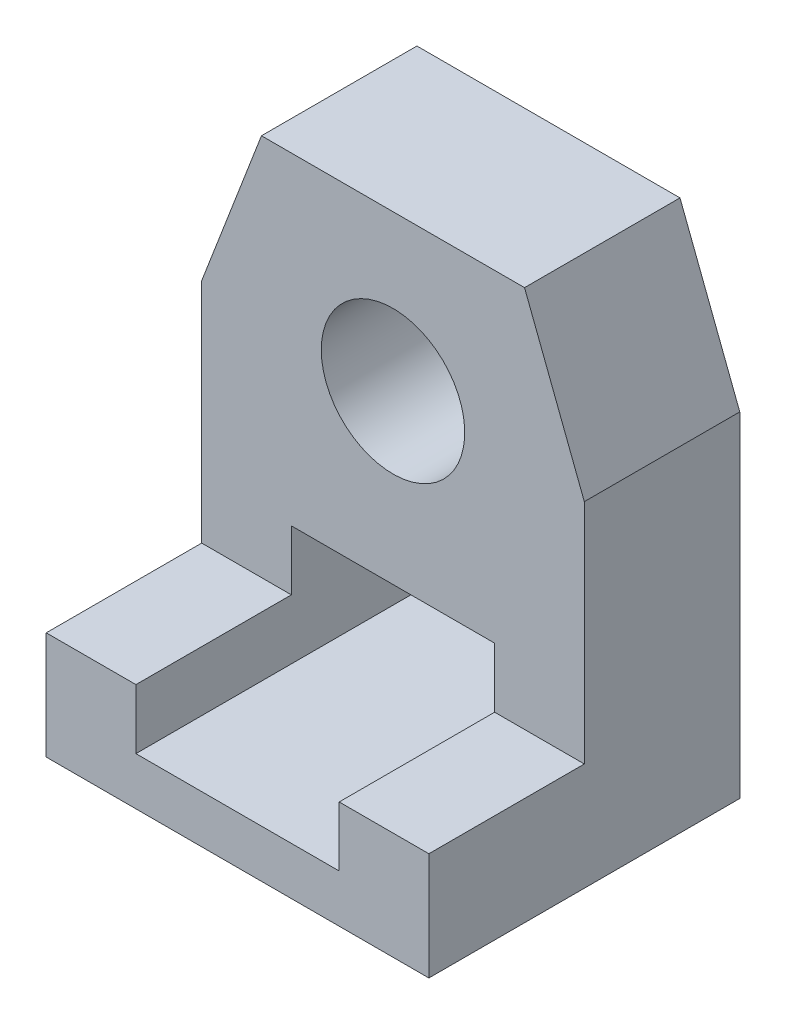
ISO-10303-21;
HEADER;
FILE_DESCRIPTION(('STEP AP214'),'2;1');
FILE_NAME('part.step','',(''),(''),'','','');
FILE_SCHEMA(('AUTOMOTIVE_DESIGN { 1 0 10303 214 1 1 1 1 }'));
ENDSEC;
DATA;
#1=APPLICATION_CONTEXT('core data for automotive mechanical design processes');
#2=APPLICATION_PROTOCOL_DEFINITION('international standard','automotive_design',2000,#1);
#3=PRODUCT_CONTEXT('',#1,'mechanical');
#4=PRODUCT('Part','Part','',(#3));
#5=PRODUCT_RELATED_PRODUCT_CATEGORY('part','',(#4));
#6=PRODUCT_DEFINITION_FORMATION('','',#4);
#7=PRODUCT_DEFINITION_CONTEXT('part definition',#1,'design');
#8=PRODUCT_DEFINITION('design','',#6,#7);
#9=PRODUCT_DEFINITION_SHAPE('','',#8);
#10=(LENGTH_UNIT() NAMED_UNIT(*) SI_UNIT(.MILLI.,.METRE.));
#11=(NAMED_UNIT(*) PLANE_ANGLE_UNIT() SI_UNIT($,.RADIAN.));
#12=(NAMED_UNIT(*) SI_UNIT($,.STERADIAN.) SOLID_ANGLE_UNIT());
#13=UNCERTAINTY_MEASURE_WITH_UNIT(LENGTH_MEASURE(1.E-05),#10,'distance_accuracy_value','');
#14=(GEOMETRIC_REPRESENTATION_CONTEXT(3) GLOBAL_UNCERTAINTY_ASSIGNED_CONTEXT((#13)) GLOBAL_UNIT_ASSIGNED_CONTEXT((#10,
#11,#12)) REPRESENTATION_CONTEXT('',''));
#15=CARTESIAN_POINT('',(0.,0.,0.));
#16=DIRECTION('',(0.,0.,1.));
#17=DIRECTION('',(1.,0.,0.));
#18=AXIS2_PLACEMENT_3D('',#15,#16,#17);
#19=CARTESIAN_POINT('',(0.,0.,13.));
#20=DIRECTION('',(0.,0.,-1.));
#21=DIRECTION('',(-1.,0.,0.));
#22=AXIS2_PLACEMENT_3D('',#19,#20,#21);
#23=PLANE('',#22);
#24=CARTESIAN_POINT('',(0.,0.,13.));
#25=DIRECTION('',(0.,0.,1.));
#26=DIRECTION('',(1.,0.,0.));
#27=AXIS2_PLACEMENT_3D('',#24,#25,#26);
#28=CIRCLE('',#27,6.);
#29=CARTESIAN_POINT('',(-6.,0.,13.));
#30=VERTEX_POINT('',#29);
#31=EDGE_CURVE('E250',#30,#30,#28,.T.);
#32=ORIENTED_EDGE('',*,*,#31,.F.);
#33=EDGE_LOOP('',(#32));
#34=FACE_BOUND('',#33,.T.);
#35=DIRECTION('',(0.,-1.,0.));
#36=VECTOR('',#35,1.);
#37=CARTESIAN_POINT('',(-16.,0.,13.));
#38=LINE('',#37,#36);
#39=CARTESIAN_POINT('',(-16.,0.,13.));
#40=VERTEX_POINT('',#39);
#41=CARTESIAN_POINT('',(-16.,-19.,13.));
#42=VERTEX_POINT('',#41);
#43=EDGE_CURVE('E269',#40,#42,#38,.T.);
#44=ORIENTED_EDGE('',*,*,#43,.T.);
#45=DIRECTION('',(1.,0.,0.));
#46=VECTOR('',#45,1.);
#47=CARTESIAN_POINT('',(0.,-19.,13.));
#48=LINE('',#47,#46);
#49=CARTESIAN_POINT('',(-8.5,-19.,13.));
#50=VERTEX_POINT('',#49);
#51=EDGE_CURVE('E158',#42,#50,#48,.T.);
#52=ORIENTED_EDGE('',*,*,#51,.T.);
#53=DIRECTION('',(0.,-1.,0.));
#54=VECTOR('',#53,1.);
#55=CARTESIAN_POINT('',(-8.5,-24.,13.));
#56=LINE('',#55,#54);
#57=CARTESIAN_POINT('',(-8.5,-14.,13.));
#58=VERTEX_POINT('',#57);
#59=EDGE_CURVE('E220',#58,#50,#56,.T.);
#60=ORIENTED_EDGE('',*,*,#59,.F.);
#61=DIRECTION('',(-1.,0.,0.));
#62=VECTOR('',#61,1.);
#63=CARTESIAN_POINT('',(8.5,-14.,13.));
#64=LINE('',#63,#62);
#65=CARTESIAN_POINT('',(8.5,-14.,13.));
#66=VERTEX_POINT('',#65);
#67=EDGE_CURVE('E216',#66,#58,#64,.T.);
#68=ORIENTED_EDGE('',*,*,#67,.F.);
#69=DIRECTION('',(0.,1.,0.));
#70=VECTOR('',#69,1.);
#71=CARTESIAN_POINT('',(8.5,-24.,13.));
#72=LINE('',#71,#70);
#73=CARTESIAN_POINT('',(8.5,-19.,13.));
#74=VERTEX_POINT('',#73);
#75=EDGE_CURVE('E213',#74,#66,#72,.T.);
#76=ORIENTED_EDGE('',*,*,#75,.F.);
#77=CARTESIAN_POINT('',(16.,-19.,13.));
#78=VERTEX_POINT('',#77);
#79=EDGE_CURVE('E181',#74,#78,#48,.T.);
#80=ORIENTED_EDGE('',*,*,#79,.T.);
#81=DIRECTION('',(0.,1.,0.));
#82=VECTOR('',#81,1.);
#83=CARTESIAN_POINT('',(16.,0.,13.));
#84=LINE('',#83,#82);
#85=CARTESIAN_POINT('',(16.,0.,13.));
#86=VERTEX_POINT('',#85);
#87=EDGE_CURVE('E272',#78,#86,#84,.T.);
#88=ORIENTED_EDGE('',*,*,#87,.T.);
#89=DIRECTION('',(-0.358979079308869,0.93334560620306,0.));
#90=VECTOR('',#89,1.);
#91=CARTESIAN_POINT('',(11.,13.,13.));
#92=LINE('',#91,#90);
#93=CARTESIAN_POINT('',(11.,13.,13.));
#94=VERTEX_POINT('',#93);
#95=EDGE_CURVE('E258',#86,#94,#92,.T.);
#96=ORIENTED_EDGE('',*,*,#95,.T.);
#97=DIRECTION('',(-1.,0.,0.));
#98=VECTOR('',#97,1.);
#99=CARTESIAN_POINT('',(-11.,13.,13.));
#100=LINE('',#99,#98);
#101=CARTESIAN_POINT('',(-11.,13.,13.));
#102=VERTEX_POINT('',#101);
#103=EDGE_CURVE('E262',#94,#102,#100,.T.);
#104=ORIENTED_EDGE('',*,*,#103,.T.);
#105=DIRECTION('',(-0.358979079308869,-0.93334560620306,0.));
#106=VECTOR('',#105,1.);
#107=CARTESIAN_POINT('',(-11.,13.,13.));
#108=LINE('',#107,#106);
#109=EDGE_CURVE('E266',#102,#40,#108,.T.);
#110=ORIENTED_EDGE('',*,*,#109,.T.);
#111=EDGE_LOOP('',(#44,#52,#60,#68,#76,#80,#88,#96,#104,#110));
#112=FACE_BOUND('',#111,.T.);
#113=ADVANCED_FACE('F47',(#34,#112),#23,.F.);
#114=CARTESIAN_POINT('',(0.,0.,0.));
#115=DIRECTION('',(0.,0.,-1.));
#116=DIRECTION('',(-1.,0.,0.));
#117=AXIS2_PLACEMENT_3D('',#114,#115,#116);
#118=PLANE('',#117);
#119=DIRECTION('',(-0.358979079308869,0.93334560620306,0.));
#120=VECTOR('',#119,1.);
#121=CARTESIAN_POINT('',(11.,13.,0.));
#122=LINE('',#121,#120);
#123=CARTESIAN_POINT('',(16.,0.,0.));
#124=VERTEX_POINT('',#123);
#125=CARTESIAN_POINT('',(11.,13.,0.));
#126=VERTEX_POINT('',#125);
#127=EDGE_CURVE('E254',#124,#126,#122,.T.);
#128=ORIENTED_EDGE('',*,*,#127,.F.);
#129=DIRECTION('',(0.,1.,0.));
#130=VECTOR('',#129,1.);
#131=CARTESIAN_POINT('',(16.,0.,0.));
#132=LINE('',#131,#130);
#133=CARTESIAN_POINT('',(16.,-28.,0.));
#134=VERTEX_POINT('',#133);
#135=EDGE_CURVE('E263',#134,#124,#132,.T.);
#136=ORIENTED_EDGE('',*,*,#135,.F.);
#137=DIRECTION('',(1.,0.,0.));
#138=VECTOR('',#137,1.);
#139=CARTESIAN_POINT('',(16.,-28.,0.));
#140=LINE('',#139,#138);
#141=CARTESIAN_POINT('',(-16.,-28.,0.));
#142=VERTEX_POINT('',#141);
#143=EDGE_CURVE('E288',#142,#134,#140,.T.);
#144=ORIENTED_EDGE('',*,*,#143,.F.);
#145=DIRECTION('',(0.,-1.,0.));
#146=VECTOR('',#145,1.);
#147=CARTESIAN_POINT('',(-16.,0.,0.));
#148=LINE('',#147,#146);
#149=CARTESIAN_POINT('',(-16.,0.,0.));
#150=VERTEX_POINT('',#149);
#151=EDGE_CURVE('E285',#150,#142,#148,.T.);
#152=ORIENTED_EDGE('',*,*,#151,.F.);
#153=DIRECTION('',(-0.358979079308869,-0.93334560620306,0.));
#154=VECTOR('',#153,1.);
#155=CARTESIAN_POINT('',(-11.,13.,0.));
#156=LINE('',#155,#154);
#157=CARTESIAN_POINT('',(-11.,13.,0.));
#158=VERTEX_POINT('',#157);
#159=EDGE_CURVE('E282',#158,#150,#156,.T.);
#160=ORIENTED_EDGE('',*,*,#159,.F.);
#161=DIRECTION('',(-1.,0.,0.));
#162=VECTOR('',#161,1.);
#163=CARTESIAN_POINT('',(-11.,13.,0.));
#164=LINE('',#163,#162);
#165=EDGE_CURVE('E279',#126,#158,#164,.T.);
#166=ORIENTED_EDGE('',*,*,#165,.F.);
#167=EDGE_LOOP('',(#128,#136,#144,#152,#160,#166));
#168=FACE_BOUND('',#167,.T.);
#169=CARTESIAN_POINT('',(0.,0.,0.));
#170=DIRECTION('',(0.,0.,1.));
#171=DIRECTION('',(1.,0.,0.));
#172=AXIS2_PLACEMENT_3D('',#169,#170,#171);
#173=CIRCLE('',#172,6.);
#174=CARTESIAN_POINT('',(-6.,0.,0.));
#175=VERTEX_POINT('',#174);
#176=EDGE_CURVE('E249',#175,#175,#173,.T.);
#177=ORIENTED_EDGE('',*,*,#176,.T.);
#178=EDGE_LOOP('',(#177));
#179=FACE_BOUND('',#178,.T.);
#180=DIRECTION('',(1.,0.,0.));
#181=VECTOR('',#180,1.);
#182=CARTESIAN_POINT('',(-8.5,-24.,0.));
#183=LINE('',#182,#181);
#184=CARTESIAN_POINT('',(-8.5,-24.,0.));
#185=VERTEX_POINT('',#184);
#186=CARTESIAN_POINT('',(8.5,-24.,0.));
#187=VERTEX_POINT('',#186);
#188=EDGE_CURVE('E217',#185,#187,#183,.T.);
#189=ORIENTED_EDGE('',*,*,#188,.T.);
#190=DIRECTION('',(0.,1.,0.));
#191=VECTOR('',#190,1.);
#192=CARTESIAN_POINT('',(8.5,-24.,0.));
#193=LINE('',#192,#191);
#194=CARTESIAN_POINT('',(8.5,-14.,0.));
#195=VERTEX_POINT('',#194);
#196=EDGE_CURVE('E71',#187,#195,#193,.T.);
#197=ORIENTED_EDGE('',*,*,#196,.T.);
#198=DIRECTION('',(-1.,0.,0.));
#199=VECTOR('',#198,1.);
#200=CARTESIAN_POINT('',(8.5,-14.,0.));
#201=LINE('',#200,#199);
#202=CARTESIAN_POINT('',(-8.5,-14.,0.));
#203=VERTEX_POINT('',#202);
#204=EDGE_CURVE('E227',#195,#203,#201,.T.);
#205=ORIENTED_EDGE('',*,*,#204,.T.);
#206=DIRECTION('',(0.,-1.,0.));
#207=VECTOR('',#206,1.);
#208=CARTESIAN_POINT('',(-8.5,-24.,0.));
#209=LINE('',#208,#207);
#210=EDGE_CURVE('E231',#203,#185,#209,.T.);
#211=ORIENTED_EDGE('',*,*,#210,.T.);
#212=EDGE_LOOP('',(#189,#197,#205,#211));
#213=FACE_BOUND('',#212,.T.);
#214=ADVANCED_FACE('F317',(#168,#179,#213),#118,.T.);
#215=CARTESIAN_POINT('',(11.,13.,13.));
#216=DIRECTION('',(-0.93334560620306,-0.358979079308869,0.));
#217=DIRECTION('',(0.358979079308869,-0.93334560620306,0.));
#218=AXIS2_PLACEMENT_3D('',#215,#216,#217);
#219=PLANE('',#218);
#220=ORIENTED_EDGE('',*,*,#127,.T.);
#221=DIRECTION('',(0.,0.,-1.));
#222=VECTOR('',#221,1.);
#223=CARTESIAN_POINT('',(11.,13.,13.));
#224=LINE('',#223,#222);
#225=EDGE_CURVE('E11',#94,#126,#224,.T.);
#226=ORIENTED_EDGE('',*,*,#225,.F.);
#227=ORIENTED_EDGE('',*,*,#95,.F.);
#228=DIRECTION('',(0.,0.,-1.));
#229=VECTOR('',#228,1.);
#230=CARTESIAN_POINT('',(16.,0.,13.));
#231=LINE('',#230,#229);
#232=EDGE_CURVE('E275',#86,#124,#231,.T.);
#233=ORIENTED_EDGE('',*,*,#232,.T.);
#234=EDGE_LOOP('',(#220,#226,#227,#233));
#235=FACE_BOUND('',#234,.T.);
#236=ADVANCED_FACE('F49',(#235),#219,.F.);
#237=CARTESIAN_POINT('',(-11.,13.,13.));
#238=DIRECTION('',(0.,-1.,0.));
#239=DIRECTION('',(0.,0.,-1.));
#240=AXIS2_PLACEMENT_3D('',#237,#238,#239);
#241=PLANE('',#240);
#242=ORIENTED_EDGE('',*,*,#165,.T.);
#243=DIRECTION('',(0.,0.,-1.));
#244=VECTOR('',#243,1.);
#245=CARTESIAN_POINT('',(-11.,13.,13.));
#246=LINE('',#245,#244);
#247=EDGE_CURVE('E56',#102,#158,#246,.T.);
#248=ORIENTED_EDGE('',*,*,#247,.F.);
#249=ORIENTED_EDGE('',*,*,#103,.F.);
#250=ORIENTED_EDGE('',*,*,#225,.T.);
#251=EDGE_LOOP('',(#242,#248,#249,#250));
#252=FACE_BOUND('',#251,.T.);
#253=ADVANCED_FACE('F344',(#252),#241,.F.);
#254=CARTESIAN_POINT('',(-11.,13.,13.));
#255=DIRECTION('',(0.93334560620306,-0.358979079308869,0.));
#256=DIRECTION('',(0.358979079308869,0.93334560620306,0.));
#257=AXIS2_PLACEMENT_3D('',#254,#255,#256);
#258=PLANE('',#257);
#259=ORIENTED_EDGE('',*,*,#159,.T.);
#260=DIRECTION('',(0.,0.,-1.));
#261=VECTOR('',#260,1.);
#262=CARTESIAN_POINT('',(-16.,0.,13.));
#263=LINE('',#262,#261);
#264=EDGE_CURVE('E302',#40,#150,#263,.T.);
#265=ORIENTED_EDGE('',*,*,#264,.F.);
#266=ORIENTED_EDGE('',*,*,#109,.F.);
#267=ORIENTED_EDGE('',*,*,#247,.T.);
#268=EDGE_LOOP('',(#259,#265,#266,#267));
#269=FACE_BOUND('',#268,.T.);
#270=ADVANCED_FACE('F311',(#269),#258,.F.);
#271=CARTESIAN_POINT('',(-16.,0.,13.));
#272=DIRECTION('',(1.,0.,0.));
#273=DIRECTION('',(0.,1.,0.));
#274=AXIS2_PLACEMENT_3D('',#271,#272,#273);
#275=PLANE('',#274);
#276=ORIENTED_EDGE('',*,*,#151,.T.);
#277=DIRECTION('',(0.,0.,-1.));
#278=VECTOR('',#277,1.);
#279=CARTESIAN_POINT('',(-16.,-28.,13.));
#280=LINE('',#279,#278);
#281=CARTESIAN_POINT('',(-16.,-28.,26.));
#282=VERTEX_POINT('',#281);
#283=EDGE_CURVE('E168',#282,#142,#280,.T.);
#284=ORIENTED_EDGE('',*,*,#283,.F.);
#285=DIRECTION('',(0.,-1.,0.));
#286=VECTOR('',#285,1.);
#287=CARTESIAN_POINT('',(-16.,0.,26.));
#288=LINE('',#287,#286);
#289=CARTESIAN_POINT('',(-16.,-19.,26.));
#290=VERTEX_POINT('',#289);
#291=EDGE_CURVE('E165',#290,#282,#288,.T.);
#292=ORIENTED_EDGE('',*,*,#291,.F.);
#293=DIRECTION('',(0.,0.,-1.));
#294=VECTOR('',#293,1.);
#295=CARTESIAN_POINT('',(-16.,-19.,26.));
#296=LINE('',#295,#294);
#297=EDGE_CURVE('E152',#290,#42,#296,.T.);
#298=ORIENTED_EDGE('',*,*,#297,.T.);
#299=ORIENTED_EDGE('',*,*,#43,.F.);
#300=ORIENTED_EDGE('',*,*,#264,.T.);
#301=EDGE_LOOP('',(#276,#284,#292,#298,#299,#300));
#302=FACE_BOUND('',#301,.T.);
#303=ADVANCED_FACE('F166',(#302),#275,.F.);
#304=CARTESIAN_POINT('',(16.,-28.,13.));
#305=DIRECTION('',(0.,1.,0.));
#306=DIRECTION('',(0.,0.,1.));
#307=AXIS2_PLACEMENT_3D('',#304,#305,#306);
#308=PLANE('',#307);
#309=ORIENTED_EDGE('',*,*,#143,.T.);
#310=DIRECTION('',(0.,0.,-1.));
#311=VECTOR('',#310,1.);
#312=CARTESIAN_POINT('',(16.,-28.,13.));
#313=LINE('',#312,#311);
#314=CARTESIAN_POINT('',(16.,-28.,26.));
#315=VERTEX_POINT('',#314);
#316=EDGE_CURVE('E296',#315,#134,#313,.T.);
#317=ORIENTED_EDGE('',*,*,#316,.F.);
#318=DIRECTION('',(1.,0.,0.));
#319=VECTOR('',#318,1.);
#320=CARTESIAN_POINT('',(0.,-28.,26.));
#321=LINE('',#320,#319);
#322=EDGE_CURVE('E173',#282,#315,#321,.T.);
#323=ORIENTED_EDGE('',*,*,#322,.F.);
#324=ORIENTED_EDGE('',*,*,#283,.T.);
#325=EDGE_LOOP('',(#309,#317,#323,#324));
#326=FACE_BOUND('',#325,.T.);
#327=ADVANCED_FACE('F322',(#326),#308,.F.);
#328=CARTESIAN_POINT('',(16.,0.,13.));
#329=DIRECTION('',(-1.,0.,0.));
#330=DIRECTION('',(0.,-1.,0.));
#331=AXIS2_PLACEMENT_3D('',#328,#329,#330);
#332=PLANE('',#331);
#333=ORIENTED_EDGE('',*,*,#135,.T.);
#334=ORIENTED_EDGE('',*,*,#232,.F.);
#335=ORIENTED_EDGE('',*,*,#87,.F.);
#336=DIRECTION('',(0.,0.,-1.));
#337=VECTOR('',#336,1.);
#338=CARTESIAN_POINT('',(16.,-19.,26.));
#339=LINE('',#338,#337);
#340=CARTESIAN_POINT('',(16.,-19.,26.));
#341=VERTEX_POINT('',#340);
#342=EDGE_CURVE('E63',#341,#78,#339,.T.);
#343=ORIENTED_EDGE('',*,*,#342,.F.);
#344=DIRECTION('',(0.,1.,0.));
#345=VECTOR('',#344,1.);
#346=CARTESIAN_POINT('',(16.,0.,26.));
#347=LINE('',#346,#345);
#348=EDGE_CURVE('E188',#315,#341,#347,.T.);
#349=ORIENTED_EDGE('',*,*,#348,.F.);
#350=ORIENTED_EDGE('',*,*,#316,.T.);
#351=EDGE_LOOP('',(#333,#334,#335,#343,#349,#350));
#352=FACE_BOUND('',#351,.T.);
#353=ADVANCED_FACE('F324',(#352),#332,.F.);
#354=CARTESIAN_POINT('',(0.,0.,13.));
#355=DIRECTION('',(0.,0.,-1.));
#356=DIRECTION('',(-1.,0.,0.));
#357=AXIS2_PLACEMENT_3D('',#354,#355,#356);
#358=CYLINDRICAL_SURFACE('',#357,6.);
#359=CARTESIAN_POINT('',(-6.,0.,13.));
#360=CARTESIAN_POINT('',(-6.,0.,12.8645833333333));
#361=CARTESIAN_POINT('',(-6.,0.,12.7291666666667));
#362=CARTESIAN_POINT('',(-6.,0.,12.4583333333333));
#363=CARTESIAN_POINT('',(-6.,0.,12.3229166666667));
#364=CARTESIAN_POINT('',(-6.,0.,12.0520833333333));
#365=CARTESIAN_POINT('',(-6.,0.,11.9166666666667));
#366=CARTESIAN_POINT('',(-6.,0.,11.6458333333333));
#367=CARTESIAN_POINT('',(-6.,0.,11.5104166666667));
#368=CARTESIAN_POINT('',(-6.,0.,11.2395833333333));
#369=CARTESIAN_POINT('',(-6.,0.,11.1041666666667));
#370=CARTESIAN_POINT('',(-6.,0.,10.8333333333333));
#371=CARTESIAN_POINT('',(-6.,0.,10.6979166666667));
#372=CARTESIAN_POINT('',(-6.,0.,10.4270833333333));
#373=CARTESIAN_POINT('',(-6.,0.,10.2916666666667));
#374=CARTESIAN_POINT('',(-6.,0.,10.0208333333333));
#375=CARTESIAN_POINT('',(-6.,0.,9.88541666666667));
#376=CARTESIAN_POINT('',(-6.,0.,9.61458333333333));
#377=CARTESIAN_POINT('',(-6.,0.,9.47916666666667));
#378=CARTESIAN_POINT('',(-6.,0.,9.20833333333333));
#379=CARTESIAN_POINT('',(-6.,0.,9.07291666666666));
#380=CARTESIAN_POINT('',(-6.,0.,8.80208333333333));
#381=CARTESIAN_POINT('',(-6.,0.,8.66666666666667));
#382=CARTESIAN_POINT('',(-6.,0.,8.39583333333333));
#383=CARTESIAN_POINT('',(-6.,0.,8.26041666666667));
#384=CARTESIAN_POINT('',(-6.,0.,7.98958333333333));
#385=CARTESIAN_POINT('',(-6.,0.,7.85416666666667));
#386=CARTESIAN_POINT('',(-6.,0.,7.58333333333333));
#387=CARTESIAN_POINT('',(-6.,0.,7.44791666666667));
#388=CARTESIAN_POINT('',(-6.,0.,7.17708333333333));
#389=CARTESIAN_POINT('',(-6.,0.,7.04166666666667));
#390=CARTESIAN_POINT('',(-6.,0.,6.77083333333333));
#391=CARTESIAN_POINT('',(-6.,0.,6.63541666666667));
#392=CARTESIAN_POINT('',(-6.,0.,6.36458333333333));
#393=CARTESIAN_POINT('',(-6.,0.,6.22916666666667));
#394=CARTESIAN_POINT('',(-6.,0.,5.95833333333333));
#395=CARTESIAN_POINT('',(-6.,0.,5.82291666666667));
#396=CARTESIAN_POINT('',(-6.,0.,5.55208333333333));
#397=CARTESIAN_POINT('',(-6.,0.,5.41666666666667));
#398=CARTESIAN_POINT('',(-6.,0.,5.14583333333333));
#399=CARTESIAN_POINT('',(-6.,0.,5.01041666666667));
#400=CARTESIAN_POINT('',(-6.,0.,4.73958333333333));
#401=CARTESIAN_POINT('',(-6.,0.,4.60416666666667));
#402=CARTESIAN_POINT('',(-6.,0.,4.33333333333333));
#403=CARTESIAN_POINT('',(-6.,0.,4.19791666666667));
#404=CARTESIAN_POINT('',(-6.,0.,3.92708333333333));
#405=CARTESIAN_POINT('',(-6.,0.,3.79166666666667));
#406=CARTESIAN_POINT('',(-6.,0.,3.52083333333333));
#407=CARTESIAN_POINT('',(-6.,0.,3.38541666666667));
#408=CARTESIAN_POINT('',(-6.,0.,3.11458333333333));
#409=CARTESIAN_POINT('',(-6.,0.,2.97916666666667));
#410=CARTESIAN_POINT('',(-6.,0.,2.70833333333333));
#411=CARTESIAN_POINT('',(-6.,0.,2.57291666666667));
#412=CARTESIAN_POINT('',(-6.,0.,2.30208333333333));
#413=CARTESIAN_POINT('',(-6.,0.,2.16666666666667));
#414=CARTESIAN_POINT('',(-6.,0.,1.89583333333333));
#415=CARTESIAN_POINT('',(-6.,0.,1.76041666666667));
#416=CARTESIAN_POINT('',(-6.,0.,1.48958333333333));
#417=CARTESIAN_POINT('',(-6.,0.,1.35416666666667));
#418=CARTESIAN_POINT('',(-6.,0.,1.08333333333333));
#419=CARTESIAN_POINT('',(-6.,0.,0.947916666666667));
#420=CARTESIAN_POINT('',(-6.,0.,0.677083333333334));
#421=CARTESIAN_POINT('',(-6.,0.,0.541666666666667));
#422=CARTESIAN_POINT('',(-6.,0.,0.270833333333334));
#423=CARTESIAN_POINT('',(-6.,0.,0.135416666666667));
#424=CARTESIAN_POINT('',(-6.,0.,0.));
#425=B_SPLINE_CURVE_WITH_KNOTS('',3,(#359,#360,#361,#362,#363,#364,#365,#366,#367,#368,#369,
#370,#371,#372,#373,#374,#375,#376,#377,#378,#379,#380,#381,#382,#383,#384,#385,#386,#387,#388,
#389,#390,#391,#392,#393,#394,#395,#396,#397,#398,#399,#400,#401,#402,#403,#404,#405,#406,#407,
#408,#409,#410,#411,#412,#413,#414,#415,#416,#417,#418,#419,#420,#421,#422,#423,#424),
.UNSPECIFIED.,.F.,.F.,(4,2,2,2,2,2,2,2,2,2,2,2,2,2,2,2,2,2,2,2,2,2,2,2,2,2,2,2,2,2,2,2,4),(0.,
0.40625,0.812500000000001,1.21875,1.625,2.03125,2.4375,2.84375,3.25,3.65625,4.0625,4.46875,
4.875,5.28125,5.6875,6.09375,6.5,6.90625,7.3125,7.71875,8.125,8.53125,8.9375,9.34375,9.75,
10.15625,10.5625,10.96875,11.375,11.78125,12.1875,12.59375,13.),.UNSPECIFIED.);
#426=EDGE_CURVE('BSEAM361',#30,#175,#425,.T.);
#427=ORIENTED_EDGE('',*,*,#31,.T.);
#428=ORIENTED_EDGE('',*,*,#176,.F.);
#429=ORIENTED_EDGE('',*,*,#426,.T.);
#430=ORIENTED_EDGE('',*,*,#426,.F.);
#431=EDGE_LOOP('',(#427,#429,#428,#430));
#432=FACE_BOUND('',#431,.T.);
#433=ADVANCED_FACE('F361',(#432),#358,.F.);
#434=CARTESIAN_POINT('',(8.5,-24.,13.));
#435=DIRECTION('',(-1.,0.,0.));
#436=DIRECTION('',(0.,0.,1.));
#437=AXIS2_PLACEMENT_3D('',#434,#435,#436);
#438=PLANE('',#437);
#439=ORIENTED_EDGE('',*,*,#196,.F.);
#440=DIRECTION('',(0.,0.,-1.));
#441=VECTOR('',#440,1.);
#442=CARTESIAN_POINT('',(8.5,-24.,13.));
#443=LINE('',#442,#441);
#444=CARTESIAN_POINT('',(8.5,-24.,26.));
#445=VERTEX_POINT('',#444);
#446=EDGE_CURVE('E224',#445,#187,#443,.T.);
#447=ORIENTED_EDGE('',*,*,#446,.F.);
#448=DIRECTION('',(0.,-1.,0.));
#449=VECTOR('',#448,1.);
#450=CARTESIAN_POINT('',(8.5,0.,26.));
#451=LINE('',#450,#449);
#452=CARTESIAN_POINT('',(8.5,-19.,26.));
#453=VERTEX_POINT('',#452);
#454=EDGE_CURVE('E187',#453,#445,#451,.T.);
#455=ORIENTED_EDGE('',*,*,#454,.F.);
#456=DIRECTION('',(0.,0.,-1.));
#457=VECTOR('',#456,1.);
#458=CARTESIAN_POINT('',(8.5,-19.,26.));
#459=LINE('',#458,#457);
#460=EDGE_CURVE('E208',#453,#74,#459,.T.);
#461=ORIENTED_EDGE('',*,*,#460,.T.);
#462=ORIENTED_EDGE('',*,*,#75,.T.);
#463=DIRECTION('',(0.,0.,-1.));
#464=VECTOR('',#463,1.);
#465=CARTESIAN_POINT('',(8.5,-14.,13.));
#466=LINE('',#465,#464);
#467=EDGE_CURVE('E246',#66,#195,#466,.T.);
#468=ORIENTED_EDGE('',*,*,#467,.T.);
#469=EDGE_LOOP('',(#439,#447,#455,#461,#462,#468));
#470=FACE_BOUND('',#469,.T.);
#471=ADVANCED_FACE('F334',(#470),#438,.T.);
#472=CARTESIAN_POINT('',(8.5,-14.,13.));
#473=DIRECTION('',(0.,-1.,0.));
#474=DIRECTION('',(0.,0.,-1.));
#475=AXIS2_PLACEMENT_3D('',#472,#473,#474);
#476=PLANE('',#475);
#477=ORIENTED_EDGE('',*,*,#204,.F.);
#478=ORIENTED_EDGE('',*,*,#467,.F.);
#479=ORIENTED_EDGE('',*,*,#67,.T.);
#480=DIRECTION('',(0.,0.,-1.));
#481=VECTOR('',#480,1.);
#482=CARTESIAN_POINT('',(-8.5,-14.,13.));
#483=LINE('',#482,#481);
#484=EDGE_CURVE('E243',#58,#203,#483,.T.);
#485=ORIENTED_EDGE('',*,*,#484,.T.);
#486=EDGE_LOOP('',(#477,#478,#479,#485));
#487=FACE_BOUND('',#486,.T.);
#488=ADVANCED_FACE('F387',(#487),#476,.T.);
#489=CARTESIAN_POINT('',(-8.5,-24.,13.));
#490=DIRECTION('',(1.,0.,0.));
#491=DIRECTION('',(0.,0.,-1.));
#492=AXIS2_PLACEMENT_3D('',#489,#490,#491);
#493=PLANE('',#492);
#494=ORIENTED_EDGE('',*,*,#210,.F.);
#495=ORIENTED_EDGE('',*,*,#484,.F.);
#496=ORIENTED_EDGE('',*,*,#59,.T.);
#497=DIRECTION('',(0.,0.,-1.));
#498=VECTOR('',#497,1.);
#499=CARTESIAN_POINT('',(-8.5,-19.,26.));
#500=LINE('',#499,#498);
#501=CARTESIAN_POINT('',(-8.5,-19.,26.));
#502=VERTEX_POINT('',#501);
#503=EDGE_CURVE('E203',#502,#50,#500,.T.);
#504=ORIENTED_EDGE('',*,*,#503,.F.);
#505=DIRECTION('',(0.,1.,0.));
#506=VECTOR('',#505,1.);
#507=CARTESIAN_POINT('',(-8.5,0.,26.));
#508=LINE('',#507,#506);
#509=CARTESIAN_POINT('',(-8.5,-24.,26.));
#510=VERTEX_POINT('',#509);
#511=EDGE_CURVE('E178',#510,#502,#508,.T.);
#512=ORIENTED_EDGE('',*,*,#511,.F.);
#513=DIRECTION('',(0.,0.,-1.));
#514=VECTOR('',#513,1.);
#515=CARTESIAN_POINT('',(-8.5,-24.,13.));
#516=LINE('',#515,#514);
#517=EDGE_CURVE('E240',#510,#185,#516,.T.);
#518=ORIENTED_EDGE('',*,*,#517,.T.);
#519=EDGE_LOOP('',(#494,#495,#496,#504,#512,#518));
#520=FACE_BOUND('',#519,.T.);
#521=ADVANCED_FACE('F341',(#520),#493,.T.);
#522=CARTESIAN_POINT('',(-8.5,-24.,13.));
#523=DIRECTION('',(0.,1.,0.));
#524=DIRECTION('',(0.,0.,1.));
#525=AXIS2_PLACEMENT_3D('',#522,#523,#524);
#526=PLANE('',#525);
#527=ORIENTED_EDGE('',*,*,#188,.F.);
#528=ORIENTED_EDGE('',*,*,#517,.F.);
#529=DIRECTION('',(-1.,0.,0.));
#530=VECTOR('',#529,1.);
#531=CARTESIAN_POINT('',(0.,-24.,26.));
#532=LINE('',#531,#530);
#533=EDGE_CURVE('E193',#445,#510,#532,.T.);
#534=ORIENTED_EDGE('',*,*,#533,.F.);
#535=ORIENTED_EDGE('',*,*,#446,.T.);
#536=EDGE_LOOP('',(#527,#528,#534,#535));
#537=FACE_BOUND('',#536,.T.);
#538=ADVANCED_FACE('F338',(#537),#526,.T.);
#539=CARTESIAN_POINT('',(0.,-19.,26.));
#540=DIRECTION('',(0.,1.,0.));
#541=DIRECTION('',(0.,0.,1.));
#542=AXIS2_PLACEMENT_3D('',#539,#540,#541);
#543=PLANE('',#542);
#544=ORIENTED_EDGE('',*,*,#51,.F.);
#545=ORIENTED_EDGE('',*,*,#297,.F.);
#546=DIRECTION('',(1.,0.,0.));
#547=VECTOR('',#546,1.);
#548=CARTESIAN_POINT('',(0.,-19.,26.));
#549=LINE('',#548,#547);
#550=EDGE_CURVE('E156',#290,#502,#549,.T.);
#551=ORIENTED_EDGE('',*,*,#550,.T.);
#552=ORIENTED_EDGE('',*,*,#503,.T.);
#553=EDGE_LOOP('',(#544,#545,#551,#552));
#554=FACE_BOUND('',#553,.T.);
#555=ADVANCED_FACE('F154',(#554),#543,.T.);
#556=ORIENTED_EDGE('',*,*,#79,.F.);
#557=ORIENTED_EDGE('',*,*,#460,.F.);
#558=EDGE_CURVE('E183',#453,#341,#549,.T.);
#559=ORIENTED_EDGE('',*,*,#558,.T.);
#560=ORIENTED_EDGE('',*,*,#342,.T.);
#561=EDGE_LOOP('',(#556,#557,#559,#560));
#562=FACE_BOUND('',#561,.T.);
#563=ADVANCED_FACE('F332',(#562),#543,.T.);
#564=CARTESIAN_POINT('',(0.,0.,26.));
#565=DIRECTION('',(0.,0.,1.));
#566=DIRECTION('',(1.,0.,0.));
#567=AXIS2_PLACEMENT_3D('',#564,#565,#566);
#568=PLANE('',#567);
#569=ORIENTED_EDGE('',*,*,#550,.F.);
#570=ORIENTED_EDGE('',*,*,#291,.T.);
#571=ORIENTED_EDGE('',*,*,#322,.T.);
#572=ORIENTED_EDGE('',*,*,#348,.T.);
#573=ORIENTED_EDGE('',*,*,#558,.F.);
#574=ORIENTED_EDGE('',*,*,#454,.T.);
#575=ORIENTED_EDGE('',*,*,#533,.T.);
#576=ORIENTED_EDGE('',*,*,#511,.T.);
#577=EDGE_LOOP('',(#569,#570,#571,#572,#573,#574,#575,#576));
#578=FACE_BOUND('',#577,.T.);
#579=ADVANCED_FACE('F175',(#578),#568,.T.);
#580=CLOSED_SHELL('',(#113,#214,#236,#253,#270,#303,#327,#353,#433,#471,#488,#521,#538,#555,
#563,#579));
#581=MANIFOLD_SOLID_BREP('B2',#580);
#582=ADVANCED_BREP_SHAPE_REPRESENTATION('',(#18,#581),#14);
#583=SHAPE_DEFINITION_REPRESENTATION(#9,#582);
ENDSEC;
END-ISO-10303-21;
